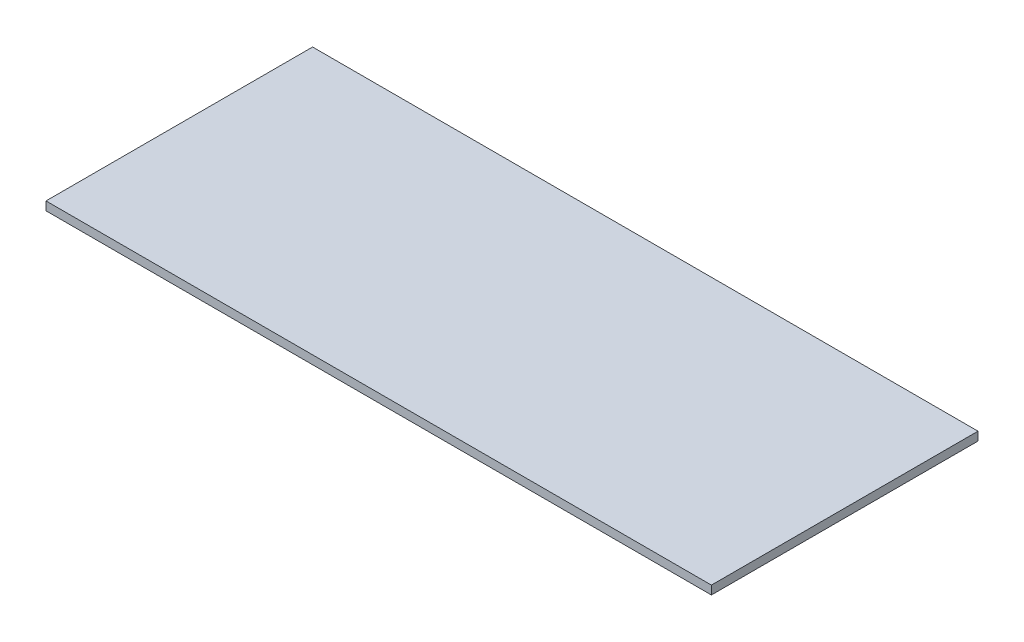
ISO-10303-21;
HEADER;
FILE_DESCRIPTION(('STEP AP214'),'2;1');
FILE_NAME('part.step','',(''),(''),'','','');
FILE_SCHEMA(('AUTOMOTIVE_DESIGN { 1 0 10303 214 1 1 1 1 }'));
ENDSEC;
DATA;
#1=APPLICATION_CONTEXT('core data for automotive mechanical design processes');
#2=APPLICATION_PROTOCOL_DEFINITION('international standard','automotive_design',2000,#1);
#3=PRODUCT_CONTEXT('',#1,'mechanical');
#4=PRODUCT('Part','Part','',(#3));
#5=PRODUCT_RELATED_PRODUCT_CATEGORY('part','',(#4));
#6=PRODUCT_DEFINITION_FORMATION('','',#4);
#7=PRODUCT_DEFINITION_CONTEXT('part definition',#1,'design');
#8=PRODUCT_DEFINITION('design','',#6,#7);
#9=PRODUCT_DEFINITION_SHAPE('','',#8);
#10=(LENGTH_UNIT() NAMED_UNIT(*) SI_UNIT(.MILLI.,.METRE.));
#11=(NAMED_UNIT(*) PLANE_ANGLE_UNIT() SI_UNIT($,.RADIAN.));
#12=(NAMED_UNIT(*) SI_UNIT($,.STERADIAN.) SOLID_ANGLE_UNIT());
#13=UNCERTAINTY_MEASURE_WITH_UNIT(LENGTH_MEASURE(1.E-05),#10,'distance_accuracy_value','');
#14=(GEOMETRIC_REPRESENTATION_CONTEXT(3) GLOBAL_UNCERTAINTY_ASSIGNED_CONTEXT((#13)) GLOBAL_UNIT_ASSIGNED_CONTEXT((#10,
#11,#12)) REPRESENTATION_CONTEXT('',''));
#15=CARTESIAN_POINT('',(0.,0.,0.));
#16=DIRECTION('',(0.,0.,1.));
#17=DIRECTION('',(1.,0.,0.));
#18=AXIS2_PLACEMENT_3D('',#15,#16,#17);
#19=CARTESIAN_POINT('',(196.85,5.08,-78.867));
#20=DIRECTION('',(-1.,0.,0.));
#21=DIRECTION('',(0.,0.,1.));
#22=AXIS2_PLACEMENT_3D('',#19,#20,#21);
#23=PLANE('',#22);
#24=DIRECTION('',(0.,0.,-1.));
#25=VECTOR('',#24,1.);
#26=CARTESIAN_POINT('',(196.85,0.,-78.867));
#27=LINE('',#26,#25);
#28=CARTESIAN_POINT('',(196.85,0.,78.867));
#29=VERTEX_POINT('',#28);
#30=CARTESIAN_POINT('',(196.85,0.,-78.867));
#31=VERTEX_POINT('',#30);
#32=EDGE_CURVE('E113',#29,#31,#27,.T.);
#33=ORIENTED_EDGE('',*,*,#32,.T.);
#34=DIRECTION('',(0.,-1.,0.));
#35=VECTOR('',#34,1.);
#36=CARTESIAN_POINT('',(196.85,5.08,-78.867));
#37=LINE('',#36,#35);
#38=CARTESIAN_POINT('',(196.85,5.08,-78.867));
#39=VERTEX_POINT('',#38);
#40=EDGE_CURVE('E11',#39,#31,#37,.T.);
#41=ORIENTED_EDGE('',*,*,#40,.F.);
#42=DIRECTION('',(0.,0.,-1.));
#43=VECTOR('',#42,1.);
#44=CARTESIAN_POINT('',(196.85,5.08,-78.867));
#45=LINE('',#44,#43);
#46=CARTESIAN_POINT('',(196.85,5.08,78.867));
#47=VERTEX_POINT('',#46);
#48=EDGE_CURVE('E97',#47,#39,#45,.T.);
#49=ORIENTED_EDGE('',*,*,#48,.F.);
#50=DIRECTION('',(0.,-1.,0.));
#51=VECTOR('',#50,1.);
#52=CARTESIAN_POINT('',(196.85,5.08,78.867));
#53=LINE('',#52,#51);
#54=EDGE_CURVE('E109',#47,#29,#53,.T.);
#55=ORIENTED_EDGE('',*,*,#54,.T.);
#56=EDGE_LOOP('',(#33,#41,#49,#55));
#57=FACE_BOUND('',#56,.T.);
#58=ADVANCED_FACE('F45',(#57),#23,.F.);
#59=CARTESIAN_POINT('',(-196.85,5.08,-78.867));
#60=DIRECTION('',(0.,0.,1.));
#61=DIRECTION('',(1.,0.,0.));
#62=AXIS2_PLACEMENT_3D('',#59,#60,#61);
#63=PLANE('',#62);
#64=DIRECTION('',(-1.,0.,0.));
#65=VECTOR('',#64,1.);
#66=CARTESIAN_POINT('',(-196.85,0.,-78.867));
#67=LINE('',#66,#65);
#68=CARTESIAN_POINT('',(-196.85,0.,-78.867));
#69=VERTEX_POINT('',#68);
#70=EDGE_CURVE('E102',#31,#69,#67,.T.);
#71=ORIENTED_EDGE('',*,*,#70,.T.);
#72=DIRECTION('',(0.,-1.,0.));
#73=VECTOR('',#72,1.);
#74=CARTESIAN_POINT('',(-196.85,5.08,-78.867));
#75=LINE('',#74,#73);
#76=CARTESIAN_POINT('',(-196.85,5.08,-78.867));
#77=VERTEX_POINT('',#76);
#78=EDGE_CURVE('E54',#77,#69,#75,.T.);
#79=ORIENTED_EDGE('',*,*,#78,.F.);
#80=DIRECTION('',(-1.,0.,0.));
#81=VECTOR('',#80,1.);
#82=CARTESIAN_POINT('',(-196.85,5.08,-78.867));
#83=LINE('',#82,#81);
#84=EDGE_CURVE('E92',#39,#77,#83,.T.);
#85=ORIENTED_EDGE('',*,*,#84,.F.);
#86=ORIENTED_EDGE('',*,*,#40,.T.);
#87=EDGE_LOOP('',(#71,#79,#85,#86));
#88=FACE_BOUND('',#87,.T.);
#89=ADVANCED_FACE('F101',(#88),#63,.F.);
#90=CARTESIAN_POINT('',(-196.85,5.08,-78.867));
#91=DIRECTION('',(1.,0.,0.));
#92=DIRECTION('',(0.,0.,-1.));
#93=AXIS2_PLACEMENT_3D('',#90,#91,#92);
#94=PLANE('',#93);
#95=DIRECTION('',(0.,0.,1.));
#96=VECTOR('',#95,1.);
#97=CARTESIAN_POINT('',(-196.85,0.,-78.867));
#98=LINE('',#97,#96);
#99=CARTESIAN_POINT('',(-196.85,0.,78.867));
#100=VERTEX_POINT('',#99);
#101=EDGE_CURVE('E79',#69,#100,#98,.T.);
#102=ORIENTED_EDGE('',*,*,#101,.T.);
#103=DIRECTION('',(0.,-1.,0.));
#104=VECTOR('',#103,1.);
#105=CARTESIAN_POINT('',(-196.85,5.08,78.867));
#106=LINE('',#105,#104);
#107=CARTESIAN_POINT('',(-196.85,5.08,78.867));
#108=VERTEX_POINT('',#107);
#109=EDGE_CURVE('E104',#108,#100,#106,.T.);
#110=ORIENTED_EDGE('',*,*,#109,.F.);
#111=DIRECTION('',(0.,0.,1.));
#112=VECTOR('',#111,1.);
#113=CARTESIAN_POINT('',(-196.85,5.08,-78.867));
#114=LINE('',#113,#112);
#115=EDGE_CURVE('E95',#77,#108,#114,.T.);
#116=ORIENTED_EDGE('',*,*,#115,.F.);
#117=ORIENTED_EDGE('',*,*,#78,.T.);
#118=EDGE_LOOP('',(#102,#110,#116,#117));
#119=FACE_BOUND('',#118,.T.);
#120=ADVANCED_FACE('F105',(#119),#94,.F.);
#121=CARTESIAN_POINT('',(-196.85,5.08,78.867));
#122=DIRECTION('',(0.,0.,-1.));
#123=DIRECTION('',(-1.,0.,0.));
#124=AXIS2_PLACEMENT_3D('',#121,#122,#123);
#125=PLANE('',#124);
#126=DIRECTION('',(1.,0.,0.));
#127=VECTOR('',#126,1.);
#128=CARTESIAN_POINT('',(-196.85,0.,78.867));
#129=LINE('',#128,#127);
#130=EDGE_CURVE('E85',#100,#29,#129,.T.);
#131=ORIENTED_EDGE('',*,*,#130,.T.);
#132=ORIENTED_EDGE('',*,*,#54,.F.);
#133=DIRECTION('',(1.,0.,0.));
#134=VECTOR('',#133,1.);
#135=CARTESIAN_POINT('',(-196.85,5.08,78.867));
#136=LINE('',#135,#134);
#137=EDGE_CURVE('E62',#108,#47,#136,.T.);
#138=ORIENTED_EDGE('',*,*,#137,.F.);
#139=ORIENTED_EDGE('',*,*,#109,.T.);
#140=EDGE_LOOP('',(#131,#132,#138,#139));
#141=FACE_BOUND('',#140,.T.);
#142=ADVANCED_FACE('F126',(#141),#125,.F.);
#143=CARTESIAN_POINT('',(0.,5.08,0.));
#144=DIRECTION('',(0.,1.,0.));
#145=DIRECTION('',(0.,0.,1.));
#146=AXIS2_PLACEMENT_3D('',#143,#144,#145);
#147=PLANE('',#146);
#148=ORIENTED_EDGE('',*,*,#48,.T.);
#149=ORIENTED_EDGE('',*,*,#84,.T.);
#150=ORIENTED_EDGE('',*,*,#115,.T.);
#151=ORIENTED_EDGE('',*,*,#137,.T.);
#152=EDGE_LOOP('',(#148,#149,#150,#151));
#153=FACE_BOUND('',#152,.T.);
#154=ADVANCED_FACE('F93',(#153),#147,.T.);
#155=CARTESIAN_POINT('',(0.,0.,0.));
#156=DIRECTION('',(0.,1.,0.));
#157=DIRECTION('',(0.,0.,1.));
#158=AXIS2_PLACEMENT_3D('',#155,#156,#157);
#159=PLANE('',#158);
#160=ORIENTED_EDGE('',*,*,#32,.F.);
#161=ORIENTED_EDGE('',*,*,#130,.F.);
#162=ORIENTED_EDGE('',*,*,#101,.F.);
#163=ORIENTED_EDGE('',*,*,#70,.F.);
#164=EDGE_LOOP('',(#160,#161,#162,#163));
#165=FACE_BOUND('',#164,.T.);
#166=ADVANCED_FACE('F129',(#165),#159,.F.);
#167=CLOSED_SHELL('',(#58,#89,#120,#142,#154,#166));
#168=MANIFOLD_SOLID_BREP('B2',#167);
#169=ADVANCED_BREP_SHAPE_REPRESENTATION('',(#18,#168),#14);
#170=SHAPE_DEFINITION_REPRESENTATION(#9,#169);
ENDSEC;
END-ISO-10303-21;
